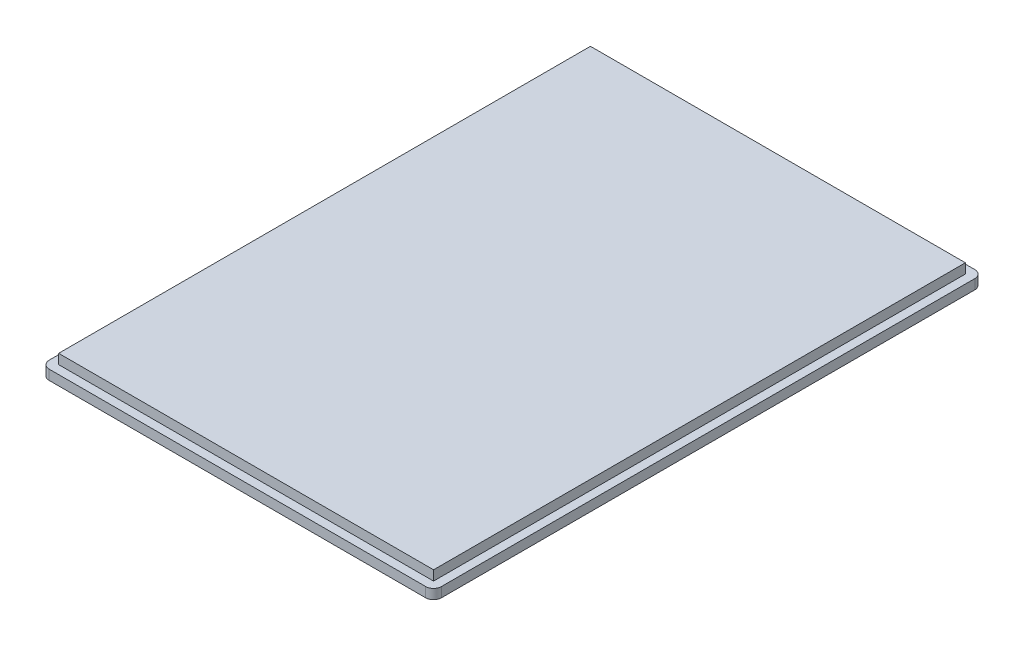
ISO-10303-21;
HEADER;
FILE_DESCRIPTION(('STEP AP214'),'2;1');
FILE_NAME('part.step','',(''),(''),'','','');
FILE_SCHEMA(('AUTOMOTIVE_DESIGN { 1 0 10303 214 1 1 1 1 }'));
ENDSEC;
DATA;
#1=APPLICATION_CONTEXT('core data for automotive mechanical design processes');
#2=APPLICATION_PROTOCOL_DEFINITION('international standard','automotive_design',2000,#1);
#3=PRODUCT_CONTEXT('',#1,'mechanical');
#4=PRODUCT('Part','Part','',(#3));
#5=PRODUCT_RELATED_PRODUCT_CATEGORY('part','',(#4));
#6=PRODUCT_DEFINITION_FORMATION('','',#4);
#7=PRODUCT_DEFINITION_CONTEXT('part definition',#1,'design');
#8=PRODUCT_DEFINITION('design','',#6,#7);
#9=PRODUCT_DEFINITION_SHAPE('','',#8);
#10=(LENGTH_UNIT() NAMED_UNIT(*) SI_UNIT(.MILLI.,.METRE.));
#11=(NAMED_UNIT(*) PLANE_ANGLE_UNIT() SI_UNIT($,.RADIAN.));
#12=(NAMED_UNIT(*) SI_UNIT($,.STERADIAN.) SOLID_ANGLE_UNIT());
#13=UNCERTAINTY_MEASURE_WITH_UNIT(LENGTH_MEASURE(1.E-05),#10,'distance_accuracy_value','');
#14=(GEOMETRIC_REPRESENTATION_CONTEXT(3) GLOBAL_UNCERTAINTY_ASSIGNED_CONTEXT((#13)) GLOBAL_UNIT_ASSIGNED_CONTEXT((#10,
#11,#12)) REPRESENTATION_CONTEXT('',''));
#15=CARTESIAN_POINT('',(0.,0.,0.));
#16=DIRECTION('',(0.,0.,1.));
#17=DIRECTION('',(1.,0.,0.));
#18=AXIS2_PLACEMENT_3D('',#15,#16,#17);
#19=CARTESIAN_POINT('',(0.,3.175,0.));
#20=DIRECTION('',(0.,-1.,0.));
#21=DIRECTION('',(0.,0.,-1.));
#22=AXIS2_PLACEMENT_3D('',#19,#20,#21);
#23=PLANE('',#22);
#24=DIRECTION('',(-1.,0.,0.));
#25=VECTOR('',#24,1.);
#26=CARTESIAN_POINT('',(0.,3.175,-177.8));
#27=LINE('',#26,#25);
#28=CARTESIAN_POINT('',(124.46,3.175,-177.8));
#29=VERTEX_POINT('',#28);
#30=CARTESIAN_POINT('',(2.54,3.175,-177.8));
#31=VERTEX_POINT('',#30);
#32=EDGE_CURVE('E167',#29,#31,#27,.T.);
#33=ORIENTED_EDGE('',*,*,#32,.T.);
#34=CARTESIAN_POINT('',(2.54,3.175,-175.26));
#35=DIRECTION('',(0.,-1.,0.));
#36=DIRECTION('',(0.,0.,-1.));
#37=AXIS2_PLACEMENT_3D('',#34,#35,#36);
#38=CIRCLE('',#37,2.54);
#39=CARTESIAN_POINT('',(0.,3.175,-175.26));
#40=VERTEX_POINT('',#39);
#41=EDGE_CURVE('E199',#31,#40,#38,.F.);
#42=ORIENTED_EDGE('',*,*,#41,.T.);
#43=DIRECTION('',(0.,0.,1.));
#44=VECTOR('',#43,1.);
#45=CARTESIAN_POINT('',(0.,3.175,0.));
#46=LINE('',#45,#44);
#47=CARTESIAN_POINT('',(0.,3.175,-2.54));
#48=VERTEX_POINT('',#47);
#49=EDGE_CURVE('E156',#40,#48,#46,.T.);
#50=ORIENTED_EDGE('',*,*,#49,.T.);
#51=CARTESIAN_POINT('',(2.54,3.175,-2.54));
#52=DIRECTION('',(0.,-1.,0.));
#53=DIRECTION('',(0.,0.,-1.));
#54=AXIS2_PLACEMENT_3D('',#51,#52,#53);
#55=CIRCLE('',#54,2.54);
#56=CARTESIAN_POINT('',(2.54,3.175,0.));
#57=VERTEX_POINT('',#56);
#58=EDGE_CURVE('E191',#48,#57,#55,.F.);
#59=ORIENTED_EDGE('',*,*,#58,.T.);
#60=DIRECTION('',(1.,0.,0.));
#61=VECTOR('',#60,1.);
#62=CARTESIAN_POINT('',(0.,3.175,0.));
#63=LINE('',#62,#61);
#64=CARTESIAN_POINT('',(124.46,3.175,0.));
#65=VERTEX_POINT('',#64);
#66=EDGE_CURVE('E157',#57,#65,#63,.T.);
#67=ORIENTED_EDGE('',*,*,#66,.T.);
#68=CARTESIAN_POINT('',(124.46,3.175,-2.54));
#69=DIRECTION('',(0.,-1.,0.));
#70=DIRECTION('',(0.,0.,-1.));
#71=AXIS2_PLACEMENT_3D('',#68,#69,#70);
#72=CIRCLE('',#71,2.54);
#73=CARTESIAN_POINT('',(127.,3.175,-2.54));
#74=VERTEX_POINT('',#73);
#75=EDGE_CURVE('E198',#65,#74,#72,.F.);
#76=ORIENTED_EDGE('',*,*,#75,.T.);
#77=DIRECTION('',(0.,0.,-1.));
#78=VECTOR('',#77,1.);
#79=CARTESIAN_POINT('',(127.,3.175,0.));
#80=LINE('',#79,#78);
#81=CARTESIAN_POINT('',(127.,3.175,-175.26));
#82=VERTEX_POINT('',#81);
#83=EDGE_CURVE('E162',#74,#82,#80,.T.);
#84=ORIENTED_EDGE('',*,*,#83,.T.);
#85=CARTESIAN_POINT('',(124.46,3.175,-175.26));
#86=DIRECTION('',(0.,-1.,0.));
#87=DIRECTION('',(0.,0.,-1.));
#88=AXIS2_PLACEMENT_3D('',#85,#86,#87);
#89=CIRCLE('',#88,2.54);
#90=EDGE_CURVE('E196',#82,#29,#89,.F.);
#91=ORIENTED_EDGE('',*,*,#90,.T.);
#92=EDGE_LOOP('',(#33,#42,#50,#59,#67,#76,#84,#91));
#93=FACE_BOUND('',#92,.T.);
#94=DIRECTION('',(0.,0.,1.));
#95=VECTOR('',#94,1.);
#96=CARTESIAN_POINT('',(2.79399999999998,3.175,-175.006));
#97=LINE('',#96,#95);
#98=CARTESIAN_POINT('',(2.79399999999998,3.175,-175.006));
#99=VERTEX_POINT('',#98);
#100=CARTESIAN_POINT('',(2.794,3.175,-2.79399999999999));
#101=VERTEX_POINT('',#100);
#102=EDGE_CURVE('E53',#99,#101,#97,.T.);
#103=ORIENTED_EDGE('',*,*,#102,.F.);
#104=DIRECTION('',(-1.,0.,0.));
#105=VECTOR('',#104,1.);
#106=CARTESIAN_POINT('',(2.79399999999998,3.175,-175.006));
#107=LINE('',#106,#105);
#108=CARTESIAN_POINT('',(124.206,3.175,-175.006));
#109=VERTEX_POINT('',#108);
#110=EDGE_CURVE('E59',#109,#99,#107,.T.);
#111=ORIENTED_EDGE('',*,*,#110,.F.);
#112=DIRECTION('',(0.,0.,-1.));
#113=VECTOR('',#112,1.);
#114=CARTESIAN_POINT('',(124.206,3.175,-175.006));
#115=LINE('',#114,#113);
#116=CARTESIAN_POINT('',(124.206,3.175,-2.79399999999999));
#117=VERTEX_POINT('',#116);
#118=EDGE_CURVE('E333',#117,#109,#115,.T.);
#119=ORIENTED_EDGE('',*,*,#118,.F.);
#120=DIRECTION('',(1.,0.,0.));
#121=VECTOR('',#120,1.);
#122=CARTESIAN_POINT('',(2.794,3.175,-2.79399999999999));
#123=LINE('',#122,#121);
#124=EDGE_CURVE('E342',#101,#117,#123,.T.);
#125=ORIENTED_EDGE('',*,*,#124,.F.);
#126=EDGE_LOOP('',(#103,#111,#119,#125));
#127=FACE_BOUND('',#126,.T.);
#128=ADVANCED_FACE('F39',(#93,#127),#23,.F.);
#129=CARTESIAN_POINT('',(0.,3.175,0.));
#130=DIRECTION('',(1.,0.,0.));
#131=DIRECTION('',(0.,0.,-1.));
#132=AXIS2_PLACEMENT_3D('',#129,#130,#131);
#133=PLANE('',#132);
#134=ORIENTED_EDGE('',*,*,#49,.F.);
#135=DIRECTION('',(0.,-1.,0.));
#136=VECTOR('',#135,1.);
#137=CARTESIAN_POINT('',(0.,3.175,-175.26));
#138=LINE('',#137,#136);
#139=CARTESIAN_POINT('',(0.,0.,-175.26));
#140=VERTEX_POINT('',#139);
#141=EDGE_CURVE('E180',#40,#140,#138,.T.);
#142=ORIENTED_EDGE('',*,*,#141,.T.);
#143=DIRECTION('',(0.,0.,1.));
#144=VECTOR('',#143,1.);
#145=CARTESIAN_POINT('',(0.,0.,0.));
#146=LINE('',#145,#144);
#147=CARTESIAN_POINT('',(0.,0.,-2.54));
#148=VERTEX_POINT('',#147);
#149=EDGE_CURVE('E150',#140,#148,#146,.T.);
#150=ORIENTED_EDGE('',*,*,#149,.T.);
#151=DIRECTION('',(0.,-1.,0.));
#152=VECTOR('',#151,1.);
#153=CARTESIAN_POINT('',(0.,3.175,-2.54));
#154=LINE('',#153,#152);
#155=EDGE_CURVE('E169',#148,#48,#154,.F.);
#156=ORIENTED_EDGE('',*,*,#155,.T.);
#157=EDGE_LOOP('',(#134,#142,#150,#156));
#158=FACE_BOUND('',#157,.T.);
#159=ADVANCED_FACE('F242',(#158),#133,.F.);
#160=CARTESIAN_POINT('',(0.,3.175,0.));
#161=DIRECTION('',(0.,0.,-1.));
#162=DIRECTION('',(-1.,0.,0.));
#163=AXIS2_PLACEMENT_3D('',#160,#161,#162);
#164=PLANE('',#163);
#165=DIRECTION('',(1.,0.,0.));
#166=VECTOR('',#165,1.);
#167=CARTESIAN_POINT('',(0.,0.,0.));
#168=LINE('',#167,#166);
#169=CARTESIAN_POINT('',(2.54,0.,0.));
#170=VERTEX_POINT('',#169);
#171=CARTESIAN_POINT('',(124.46,0.,0.));
#172=VERTEX_POINT('',#171);
#173=EDGE_CURVE('E147',#170,#172,#168,.T.);
#174=ORIENTED_EDGE('',*,*,#173,.T.);
#175=DIRECTION('',(0.,-1.,0.));
#176=VECTOR('',#175,1.);
#177=CARTESIAN_POINT('',(124.46,3.175,0.));
#178=LINE('',#177,#176);
#179=EDGE_CURVE('E11',#172,#65,#178,.F.);
#180=ORIENTED_EDGE('',*,*,#179,.T.);
#181=ORIENTED_EDGE('',*,*,#66,.F.);
#182=DIRECTION('',(0.,-1.,0.));
#183=VECTOR('',#182,1.);
#184=CARTESIAN_POINT('',(2.54,3.175,0.));
#185=LINE('',#184,#183);
#186=EDGE_CURVE('E50',#57,#170,#185,.T.);
#187=ORIENTED_EDGE('',*,*,#186,.T.);
#188=EDGE_LOOP('',(#174,#180,#181,#187));
#189=FACE_BOUND('',#188,.T.);
#190=ADVANCED_FACE('F211',(#189),#164,.F.);
#191=CARTESIAN_POINT('',(127.,3.175,0.));
#192=DIRECTION('',(-1.,0.,0.));
#193=DIRECTION('',(0.,0.,1.));
#194=AXIS2_PLACEMENT_3D('',#191,#192,#193);
#195=PLANE('',#194);
#196=DIRECTION('',(0.,0.,-1.));
#197=VECTOR('',#196,1.);
#198=CARTESIAN_POINT('',(127.,0.,0.));
#199=LINE('',#198,#197);
#200=CARTESIAN_POINT('',(127.,0.,-2.54));
#201=VERTEX_POINT('',#200);
#202=CARTESIAN_POINT('',(127.,0.,-175.26));
#203=VERTEX_POINT('',#202);
#204=EDGE_CURVE('E175',#201,#203,#199,.T.);
#205=ORIENTED_EDGE('',*,*,#204,.T.);
#206=DIRECTION('',(0.,-1.,0.));
#207=VECTOR('',#206,1.);
#208=CARTESIAN_POINT('',(127.,3.175,-175.26));
#209=LINE('',#208,#207);
#210=EDGE_CURVE('E202',#203,#82,#209,.F.);
#211=ORIENTED_EDGE('',*,*,#210,.T.);
#212=ORIENTED_EDGE('',*,*,#83,.F.);
#213=DIRECTION('',(0.,-1.,0.));
#214=VECTOR('',#213,1.);
#215=CARTESIAN_POINT('',(127.,3.175,-2.54));
#216=LINE('',#215,#214);
#217=EDGE_CURVE('E205',#74,#201,#216,.T.);
#218=ORIENTED_EDGE('',*,*,#217,.T.);
#219=EDGE_LOOP('',(#205,#211,#212,#218));
#220=FACE_BOUND('',#219,.T.);
#221=ADVANCED_FACE('F223',(#220),#195,.F.);
#222=CARTESIAN_POINT('',(0.,3.175,-177.8));
#223=DIRECTION('',(0.,0.,1.));
#224=DIRECTION('',(1.,0.,0.));
#225=AXIS2_PLACEMENT_3D('',#222,#223,#224);
#226=PLANE('',#225);
#227=DIRECTION('',(-1.,0.,0.));
#228=VECTOR('',#227,1.);
#229=CARTESIAN_POINT('',(0.,0.,-177.8));
#230=LINE('',#229,#228);
#231=CARTESIAN_POINT('',(124.46,0.,-177.8));
#232=VERTEX_POINT('',#231);
#233=CARTESIAN_POINT('',(2.54,0.,-177.8));
#234=VERTEX_POINT('',#233);
#235=EDGE_CURVE('E159',#232,#234,#230,.T.);
#236=ORIENTED_EDGE('',*,*,#235,.T.);
#237=DIRECTION('',(0.,-1.,0.));
#238=VECTOR('',#237,1.);
#239=CARTESIAN_POINT('',(2.54,3.175,-177.8));
#240=LINE('',#239,#238);
#241=EDGE_CURVE('E194',#234,#31,#240,.F.);
#242=ORIENTED_EDGE('',*,*,#241,.T.);
#243=ORIENTED_EDGE('',*,*,#32,.F.);
#244=DIRECTION('',(0.,-1.,0.));
#245=VECTOR('',#244,1.);
#246=CARTESIAN_POINT('',(124.46,3.175,-177.8));
#247=LINE('',#246,#245);
#248=EDGE_CURVE('E188',#29,#232,#247,.T.);
#249=ORIENTED_EDGE('',*,*,#248,.T.);
#250=EDGE_LOOP('',(#236,#242,#243,#249));
#251=FACE_BOUND('',#250,.T.);
#252=ADVANCED_FACE('F233',(#251),#226,.F.);
#253=CARTESIAN_POINT('',(0.,0.,0.));
#254=DIRECTION('',(0.,-1.,0.));
#255=DIRECTION('',(0.,0.,-1.));
#256=AXIS2_PLACEMENT_3D('',#253,#254,#255);
#257=PLANE('',#256);
#258=ORIENTED_EDGE('',*,*,#149,.F.);
#259=CARTESIAN_POINT('',(2.54,0.,-175.26));
#260=DIRECTION('',(0.,-1.,0.));
#261=DIRECTION('',(0.,0.,-1.));
#262=AXIS2_PLACEMENT_3D('',#259,#260,#261);
#263=CIRCLE('',#262,2.54);
#264=EDGE_CURVE('E190',#140,#234,#263,.T.);
#265=ORIENTED_EDGE('',*,*,#264,.T.);
#266=ORIENTED_EDGE('',*,*,#235,.F.);
#267=CARTESIAN_POINT('',(124.46,0.,-175.26));
#268=DIRECTION('',(0.,-1.,0.));
#269=DIRECTION('',(0.,0.,-1.));
#270=AXIS2_PLACEMENT_3D('',#267,#268,#269);
#271=CIRCLE('',#270,2.54);
#272=EDGE_CURVE('E183',#232,#203,#271,.T.);
#273=ORIENTED_EDGE('',*,*,#272,.T.);
#274=ORIENTED_EDGE('',*,*,#204,.F.);
#275=CARTESIAN_POINT('',(124.46,0.,-2.54));
#276=DIRECTION('',(0.,-1.,0.));
#277=DIRECTION('',(0.,0.,-1.));
#278=AXIS2_PLACEMENT_3D('',#275,#276,#277);
#279=CIRCLE('',#278,2.54);
#280=EDGE_CURVE('E181',#201,#172,#279,.T.);
#281=ORIENTED_EDGE('',*,*,#280,.T.);
#282=ORIENTED_EDGE('',*,*,#173,.F.);
#283=CARTESIAN_POINT('',(2.54,0.,-2.54));
#284=DIRECTION('',(0.,-1.,0.));
#285=DIRECTION('',(0.,0.,-1.));
#286=AXIS2_PLACEMENT_3D('',#283,#284,#285);
#287=CIRCLE('',#286,2.54);
#288=EDGE_CURVE('E182',#170,#148,#287,.T.);
#289=ORIENTED_EDGE('',*,*,#288,.T.);
#290=EDGE_LOOP('',(#258,#265,#266,#273,#274,#281,#282,#289));
#291=FACE_BOUND('',#290,.T.);
#292=ADVANCED_FACE('F220',(#291),#257,.T.);
#293=CARTESIAN_POINT('',(2.54,3.175,-175.26));
#294=DIRECTION('',(0.,-1.,0.));
#295=DIRECTION('',(0.,0.,-1.));
#296=AXIS2_PLACEMENT_3D('',#293,#294,#295);
#297=CYLINDRICAL_SURFACE('',#296,2.54);
#298=ORIENTED_EDGE('',*,*,#41,.F.);
#299=ORIENTED_EDGE('',*,*,#241,.F.);
#300=ORIENTED_EDGE('',*,*,#264,.F.);
#301=ORIENTED_EDGE('',*,*,#141,.F.);
#302=EDGE_LOOP('',(#298,#299,#300,#301));
#303=FACE_BOUND('',#302,.T.);
#304=ADVANCED_FACE('F238',(#303),#297,.T.);
#305=CARTESIAN_POINT('',(124.46,3.175,-175.26));
#306=DIRECTION('',(0.,-1.,0.));
#307=DIRECTION('',(0.,0.,-1.));
#308=AXIS2_PLACEMENT_3D('',#305,#306,#307);
#309=CYLINDRICAL_SURFACE('',#308,2.54);
#310=ORIENTED_EDGE('',*,*,#90,.F.);
#311=ORIENTED_EDGE('',*,*,#210,.F.);
#312=ORIENTED_EDGE('',*,*,#272,.F.);
#313=ORIENTED_EDGE('',*,*,#248,.F.);
#314=EDGE_LOOP('',(#310,#311,#312,#313));
#315=FACE_BOUND('',#314,.T.);
#316=ADVANCED_FACE('F234',(#315),#309,.T.);
#317=CARTESIAN_POINT('',(124.46,3.175,-2.54));
#318=DIRECTION('',(0.,-1.,0.));
#319=DIRECTION('',(0.,0.,-1.));
#320=AXIS2_PLACEMENT_3D('',#317,#318,#319);
#321=CYLINDRICAL_SURFACE('',#320,2.54);
#322=ORIENTED_EDGE('',*,*,#75,.F.);
#323=ORIENTED_EDGE('',*,*,#179,.F.);
#324=ORIENTED_EDGE('',*,*,#280,.F.);
#325=ORIENTED_EDGE('',*,*,#217,.F.);
#326=EDGE_LOOP('',(#322,#323,#324,#325));
#327=FACE_BOUND('',#326,.T.);
#328=ADVANCED_FACE('F225',(#327),#321,.T.);
#329=CARTESIAN_POINT('',(2.54,3.175,-2.54));
#330=DIRECTION('',(0.,-1.,0.));
#331=DIRECTION('',(0.,0.,-1.));
#332=AXIS2_PLACEMENT_3D('',#329,#330,#331);
#333=CYLINDRICAL_SURFACE('',#332,2.54);
#334=ORIENTED_EDGE('',*,*,#58,.F.);
#335=ORIENTED_EDGE('',*,*,#155,.F.);
#336=ORIENTED_EDGE('',*,*,#288,.F.);
#337=ORIENTED_EDGE('',*,*,#186,.F.);
#338=EDGE_LOOP('',(#334,#335,#336,#337));
#339=FACE_BOUND('',#338,.T.);
#340=ADVANCED_FACE('F41',(#339),#333,.T.);
#341=CARTESIAN_POINT('',(2.79399999999998,6.35,-175.006));
#342=DIRECTION('',(1.,0.,0.));
#343=DIRECTION('',(0.,0.,-1.));
#344=AXIS2_PLACEMENT_3D('',#341,#342,#343);
#345=PLANE('',#344);
#346=ORIENTED_EDGE('',*,*,#102,.T.);
#347=DIRECTION('',(0.,-1.,0.));
#348=VECTOR('',#347,1.);
#349=CARTESIAN_POINT('',(2.794,6.35,-2.79399999999999));
#350=LINE('',#349,#348);
#351=CARTESIAN_POINT('',(2.794,6.35,-2.79399999999999));
#352=VERTEX_POINT('',#351);
#353=EDGE_CURVE('E128',#352,#101,#350,.T.);
#354=ORIENTED_EDGE('',*,*,#353,.F.);
#355=DIRECTION('',(0.,0.,1.));
#356=VECTOR('',#355,1.);
#357=CARTESIAN_POINT('',(2.79399999999998,6.35,-175.006));
#358=LINE('',#357,#356);
#359=CARTESIAN_POINT('',(2.79399999999998,6.35,-175.006));
#360=VERTEX_POINT('',#359);
#361=EDGE_CURVE('E137',#360,#352,#358,.T.);
#362=ORIENTED_EDGE('',*,*,#361,.F.);
#363=DIRECTION('',(0.,-1.,0.));
#364=VECTOR('',#363,1.);
#365=CARTESIAN_POINT('',(2.79399999999998,6.35,-175.006));
#366=LINE('',#365,#364);
#367=EDGE_CURVE('E334',#360,#99,#366,.T.);
#368=ORIENTED_EDGE('',*,*,#367,.T.);
#369=EDGE_LOOP('',(#346,#354,#362,#368));
#370=FACE_BOUND('',#369,.T.);
#371=ADVANCED_FACE('F148',(#370),#345,.F.);
#372=CARTESIAN_POINT('',(2.794,6.35,-2.79399999999999));
#373=DIRECTION('',(0.,0.,-1.));
#374=DIRECTION('',(-1.,0.,0.));
#375=AXIS2_PLACEMENT_3D('',#372,#373,#374);
#376=PLANE('',#375);
#377=ORIENTED_EDGE('',*,*,#124,.T.);
#378=DIRECTION('',(0.,-1.,0.));
#379=VECTOR('',#378,1.);
#380=CARTESIAN_POINT('',(124.206,6.35,-2.79399999999999));
#381=LINE('',#380,#379);
#382=CARTESIAN_POINT('',(124.206,6.35,-2.79399999999999));
#383=VERTEX_POINT('',#382);
#384=EDGE_CURVE('E135',#383,#117,#381,.T.);
#385=ORIENTED_EDGE('',*,*,#384,.F.);
#386=DIRECTION('',(1.,0.,0.));
#387=VECTOR('',#386,1.);
#388=CARTESIAN_POINT('',(2.794,6.35,-2.79399999999999));
#389=LINE('',#388,#387);
#390=EDGE_CURVE('E123',#352,#383,#389,.T.);
#391=ORIENTED_EDGE('',*,*,#390,.F.);
#392=ORIENTED_EDGE('',*,*,#353,.T.);
#393=EDGE_LOOP('',(#377,#385,#391,#392));
#394=FACE_BOUND('',#393,.T.);
#395=ADVANCED_FACE('F126',(#394),#376,.F.);
#396=CARTESIAN_POINT('',(124.206,6.35,-175.006));
#397=DIRECTION('',(-1.,0.,0.));
#398=DIRECTION('',(0.,0.,1.));
#399=AXIS2_PLACEMENT_3D('',#396,#397,#398);
#400=PLANE('',#399);
#401=ORIENTED_EDGE('',*,*,#118,.T.);
#402=DIRECTION('',(0.,-1.,0.));
#403=VECTOR('',#402,1.);
#404=CARTESIAN_POINT('',(124.206,6.35,-175.006));
#405=LINE('',#404,#403);
#406=CARTESIAN_POINT('',(124.206,6.35,-175.006));
#407=VERTEX_POINT('',#406);
#408=EDGE_CURVE('E155',#407,#109,#405,.T.);
#409=ORIENTED_EDGE('',*,*,#408,.F.);
#410=DIRECTION('',(0.,0.,-1.));
#411=VECTOR('',#410,1.);
#412=CARTESIAN_POINT('',(124.206,6.35,-175.006));
#413=LINE('',#412,#411);
#414=EDGE_CURVE('E134',#383,#407,#413,.T.);
#415=ORIENTED_EDGE('',*,*,#414,.F.);
#416=ORIENTED_EDGE('',*,*,#384,.T.);
#417=EDGE_LOOP('',(#401,#409,#415,#416));
#418=FACE_BOUND('',#417,.T.);
#419=ADVANCED_FACE('F305',(#418),#400,.F.);
#420=CARTESIAN_POINT('',(2.79399999999998,6.35,-175.006));
#421=DIRECTION('',(0.,0.,1.));
#422=DIRECTION('',(1.,0.,0.));
#423=AXIS2_PLACEMENT_3D('',#420,#421,#422);
#424=PLANE('',#423);
#425=ORIENTED_EDGE('',*,*,#110,.T.);
#426=ORIENTED_EDGE('',*,*,#367,.F.);
#427=DIRECTION('',(-1.,0.,0.));
#428=VECTOR('',#427,1.);
#429=CARTESIAN_POINT('',(2.79399999999998,6.35,-175.006));
#430=LINE('',#429,#428);
#431=EDGE_CURVE('E143',#407,#360,#430,.T.);
#432=ORIENTED_EDGE('',*,*,#431,.F.);
#433=ORIENTED_EDGE('',*,*,#408,.T.);
#434=EDGE_LOOP('',(#425,#426,#432,#433));
#435=FACE_BOUND('',#434,.T.);
#436=ADVANCED_FACE('F313',(#435),#424,.F.);
#437=CARTESIAN_POINT('',(0.,6.35,0.));
#438=DIRECTION('',(0.,1.,0.));
#439=DIRECTION('',(0.,0.,1.));
#440=AXIS2_PLACEMENT_3D('',#437,#438,#439);
#441=PLANE('',#440);
#442=ORIENTED_EDGE('',*,*,#361,.T.);
#443=ORIENTED_EDGE('',*,*,#390,.T.);
#444=ORIENTED_EDGE('',*,*,#414,.T.);
#445=ORIENTED_EDGE('',*,*,#431,.T.);
#446=EDGE_LOOP('',(#442,#443,#444,#445));
#447=FACE_BOUND('',#446,.T.);
#448=ADVANCED_FACE('F136',(#447),#441,.T.);
#449=CLOSED_SHELL('',(#128,#159,#190,#221,#252,#292,#304,#316,#328,#340,#371,#395,#419,#436,#448));
#450=MANIFOLD_SOLID_BREP('B2',#449);
#451=ADVANCED_BREP_SHAPE_REPRESENTATION('',(#18,#450),#14);
#452=SHAPE_DEFINITION_REPRESENTATION(#9,#451);
ENDSEC;
END-ISO-10303-21;
